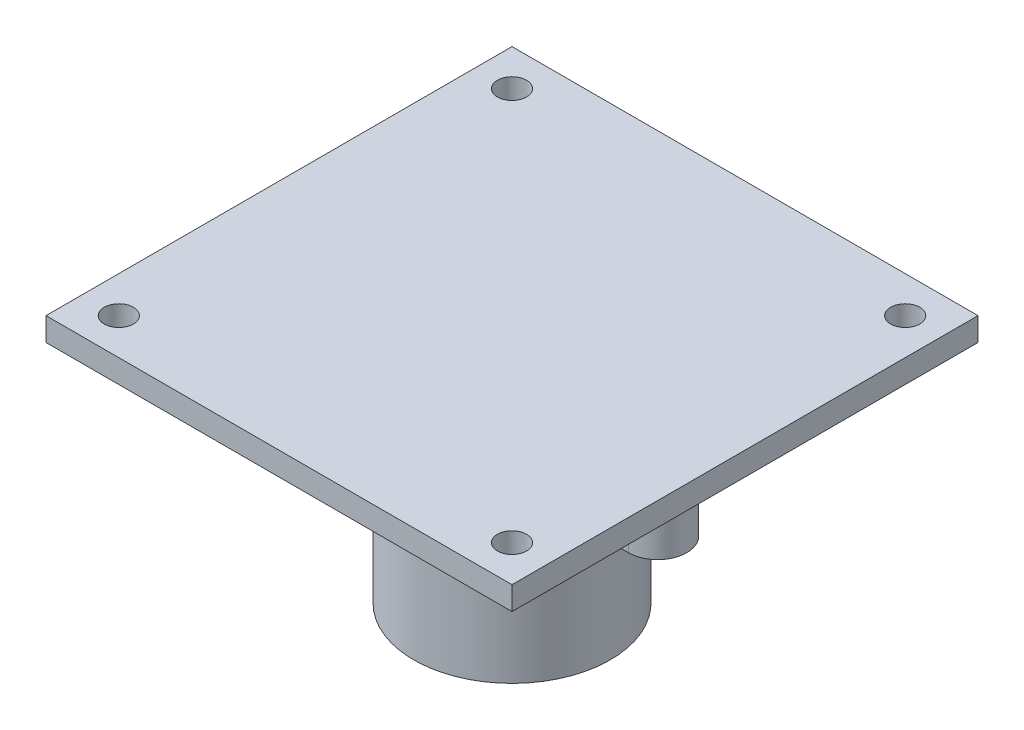
ISO-10303-21;
HEADER;
FILE_DESCRIPTION(('STEP AP214'),'2;1');
FILE_NAME('part.step','',(''),(''),'','','');
FILE_SCHEMA(('AUTOMOTIVE_DESIGN { 1 0 10303 214 1 1 1 1 }'));
ENDSEC;
DATA;
#1=APPLICATION_CONTEXT('core data for automotive mechanical design processes');
#2=APPLICATION_PROTOCOL_DEFINITION('international standard','automotive_design',2000,#1);
#3=PRODUCT_CONTEXT('',#1,'mechanical');
#4=PRODUCT('Part','Part','',(#3));
#5=PRODUCT_RELATED_PRODUCT_CATEGORY('part','',(#4));
#6=PRODUCT_DEFINITION_FORMATION('','',#4);
#7=PRODUCT_DEFINITION_CONTEXT('part definition',#1,'design');
#8=PRODUCT_DEFINITION('design','',#6,#7);
#9=PRODUCT_DEFINITION_SHAPE('','',#8);
#10=(LENGTH_UNIT() NAMED_UNIT(*) SI_UNIT(.MILLI.,.METRE.));
#11=(NAMED_UNIT(*) PLANE_ANGLE_UNIT() SI_UNIT($,.RADIAN.));
#12=(NAMED_UNIT(*) SI_UNIT($,.STERADIAN.) SOLID_ANGLE_UNIT());
#13=UNCERTAINTY_MEASURE_WITH_UNIT(LENGTH_MEASURE(1.E-05),#10,'distance_accuracy_value','');
#14=(GEOMETRIC_REPRESENTATION_CONTEXT(3) GLOBAL_UNCERTAINTY_ASSIGNED_CONTEXT((#13)) GLOBAL_UNIT_ASSIGNED_CONTEXT((#10,
#11,#12)) REPRESENTATION_CONTEXT('',''));
#15=CARTESIAN_POINT('',(0.,0.,0.));
#16=DIRECTION('',(0.,0.,1.));
#17=DIRECTION('',(1.,0.,0.));
#18=AXIS2_PLACEMENT_3D('',#15,#16,#17);
#19=CARTESIAN_POINT('',(0.,0.,0.));
#20=DIRECTION('',(0.,-1.,0.));
#21=DIRECTION('',(0.,0.,-1.));
#22=AXIS2_PLACEMENT_3D('',#19,#20,#21);
#23=PLANE('',#22);
#24=CARTESIAN_POINT('',(-13.5,0.,-13.5));
#25=DIRECTION('',(0.,1.,0.));
#26=DIRECTION('',(0.,0.,1.));
#27=AXIS2_PLACEMENT_3D('',#24,#25,#26);
#28=CIRCLE('',#27,0.999999999999999);
#29=CARTESIAN_POINT('',(-13.5,0.,-12.5));
#30=VERTEX_POINT('',#29);
#31=EDGE_CURVE('E190',#30,#30,#28,.T.);
#32=ORIENTED_EDGE('',*,*,#31,.T.);
#33=EDGE_LOOP('',(#32));
#34=FACE_BOUND('',#33,.T.);
#35=CARTESIAN_POINT('',(13.5,0.,-13.5));
#36=DIRECTION('',(0.,1.,0.));
#37=DIRECTION('',(0.,0.,1.));
#38=AXIS2_PLACEMENT_3D('',#35,#36,#37);
#39=CIRCLE('',#38,1.);
#40=CARTESIAN_POINT('',(13.5,0.,-12.5));
#41=VERTEX_POINT('',#40);
#42=EDGE_CURVE('E201',#41,#41,#39,.T.);
#43=ORIENTED_EDGE('',*,*,#42,.T.);
#44=EDGE_LOOP('',(#43));
#45=FACE_BOUND('',#44,.T.);
#46=DIRECTION('',(0.,0.,-1.));
#47=VECTOR('',#46,1.);
#48=CARTESIAN_POINT('',(16.,0.,16.));
#49=LINE('',#48,#47);
#50=CARTESIAN_POINT('',(16.,0.,16.));
#51=VERTEX_POINT('',#50);
#52=CARTESIAN_POINT('',(16.,0.,-16.));
#53=VERTEX_POINT('',#52);
#54=EDGE_CURVE('E207',#51,#53,#49,.T.);
#55=ORIENTED_EDGE('',*,*,#54,.F.);
#56=DIRECTION('',(1.,0.,0.));
#57=VECTOR('',#56,1.);
#58=CARTESIAN_POINT('',(-16.,0.,16.));
#59=LINE('',#58,#57);
#60=CARTESIAN_POINT('',(-16.,0.,16.));
#61=VERTEX_POINT('',#60);
#62=EDGE_CURVE('E214',#61,#51,#59,.T.);
#63=ORIENTED_EDGE('',*,*,#62,.F.);
#64=DIRECTION('',(0.,0.,1.));
#65=VECTOR('',#64,1.);
#66=CARTESIAN_POINT('',(-16.,0.,16.));
#67=LINE('',#66,#65);
#68=CARTESIAN_POINT('',(-16.,0.,-16.));
#69=VERTEX_POINT('',#68);
#70=EDGE_CURVE('E225',#69,#61,#67,.T.);
#71=ORIENTED_EDGE('',*,*,#70,.F.);
#72=DIRECTION('',(-1.,0.,0.));
#73=VECTOR('',#72,1.);
#74=CARTESIAN_POINT('',(-16.,0.,-16.));
#75=LINE('',#74,#73);
#76=EDGE_CURVE('E223',#53,#69,#75,.T.);
#77=ORIENTED_EDGE('',*,*,#76,.F.);
#78=EDGE_LOOP('',(#55,#63,#71,#77));
#79=FACE_BOUND('',#78,.T.);
#80=CARTESIAN_POINT('',(-13.5,0.,13.5));
#81=DIRECTION('',(0.,1.,0.));
#82=DIRECTION('',(0.,0.,-1.));
#83=AXIS2_PLACEMENT_3D('',#80,#81,#82);
#84=CIRCLE('',#83,0.999999999999999);
#85=CARTESIAN_POINT('',(-13.5,0.,12.5));
#86=VERTEX_POINT('',#85);
#87=EDGE_CURVE('E195',#86,#86,#84,.T.);
#88=ORIENTED_EDGE('',*,*,#87,.T.);
#89=EDGE_LOOP('',(#88));
#90=FACE_BOUND('',#89,.T.);
#91=CARTESIAN_POINT('',(13.5,0.,13.5));
#92=DIRECTION('',(0.,1.,0.));
#93=DIRECTION('',(0.,0.,-1.));
#94=AXIS2_PLACEMENT_3D('',#91,#92,#93);
#95=CIRCLE('',#94,0.999999999999999);
#96=CARTESIAN_POINT('',(13.5,0.,12.5));
#97=VERTEX_POINT('',#96);
#98=EDGE_CURVE('E180',#97,#97,#95,.T.);
#99=ORIENTED_EDGE('',*,*,#98,.T.);
#100=EDGE_LOOP('',(#99));
#101=FACE_BOUND('',#100,.T.);
#102=DIRECTION('',(0.,0.,1.));
#103=VECTOR('',#102,1.);
#104=CARTESIAN_POINT('',(8.,0.,0.));
#105=LINE('',#104,#103);
#106=CARTESIAN_POINT('',(8.,0.,-8.));
#107=VERTEX_POINT('',#106);
#108=CARTESIAN_POINT('',(8.,0.,-2.));
#109=VERTEX_POINT('',#108);
#110=EDGE_CURVE('E59',#107,#109,#105,.T.);
#111=ORIENTED_EDGE('',*,*,#110,.F.);
#112=DIRECTION('',(1.,0.,0.));
#113=VECTOR('',#112,1.);
#114=CARTESIAN_POINT('',(0.,0.,-8.));
#115=LINE('',#114,#113);
#116=CARTESIAN_POINT('',(-8.,0.,-8.));
#117=VERTEX_POINT('',#116);
#118=EDGE_CURVE('E179',#117,#107,#115,.T.);
#119=ORIENTED_EDGE('',*,*,#118,.F.);
#120=DIRECTION('',(0.,0.,1.));
#121=VECTOR('',#120,1.);
#122=CARTESIAN_POINT('',(-8.,0.,0.));
#123=LINE('',#122,#121);
#124=CARTESIAN_POINT('',(-8.,0.,-2.));
#125=VERTEX_POINT('',#124);
#126=EDGE_CURVE('E176',#117,#125,#123,.T.);
#127=ORIENTED_EDGE('',*,*,#126,.T.);
#128=DIRECTION('',(-1.,0.,0.));
#129=VECTOR('',#128,1.);
#130=CARTESIAN_POINT('',(0.,0.,-2.));
#131=LINE('',#130,#129);
#132=CARTESIAN_POINT('',(-10.,0.,-2.));
#133=VERTEX_POINT('',#132);
#134=EDGE_CURVE('E541',#125,#133,#131,.T.);
#135=ORIENTED_EDGE('',*,*,#134,.T.);
#136=CARTESIAN_POINT('',(-10.,0.,0.));
#137=DIRECTION('',(0.,-1.,0.));
#138=DIRECTION('',(0.,0.,-1.));
#139=AXIS2_PLACEMENT_3D('',#136,#137,#138);
#140=CIRCLE('',#139,2.);
#141=CARTESIAN_POINT('',(-10.,0.,2.));
#142=VERTEX_POINT('',#141);
#143=EDGE_CURVE('E538',#142,#133,#140,.T.);
#144=ORIENTED_EDGE('',*,*,#143,.F.);
#145=DIRECTION('',(-1.,0.,0.));
#146=VECTOR('',#145,1.);
#147=CARTESIAN_POINT('',(0.,0.,2.));
#148=LINE('',#147,#146);
#149=CARTESIAN_POINT('',(-8.,0.,2.));
#150=VERTEX_POINT('',#149);
#151=EDGE_CURVE('E535',#150,#142,#148,.T.);
#152=ORIENTED_EDGE('',*,*,#151,.F.);
#153=CARTESIAN_POINT('',(-8.,0.,8.));
#154=VERTEX_POINT('',#153);
#155=EDGE_CURVE('E533',#150,#154,#123,.T.);
#156=ORIENTED_EDGE('',*,*,#155,.T.);
#157=DIRECTION('',(1.,0.,0.));
#158=VECTOR('',#157,1.);
#159=CARTESIAN_POINT('',(0.,0.,8.));
#160=LINE('',#159,#158);
#161=CARTESIAN_POINT('',(8.,0.,8.));
#162=VERTEX_POINT('',#161);
#163=EDGE_CURVE('E531',#154,#162,#160,.T.);
#164=ORIENTED_EDGE('',*,*,#163,.T.);
#165=CARTESIAN_POINT('',(8.,0.,2.));
#166=VERTEX_POINT('',#165);
#167=EDGE_CURVE('E525',#166,#162,#105,.T.);
#168=ORIENTED_EDGE('',*,*,#167,.F.);
#169=DIRECTION('',(1.,0.,0.));
#170=VECTOR('',#169,1.);
#171=CARTESIAN_POINT('',(0.,0.,2.));
#172=LINE('',#171,#170);
#173=CARTESIAN_POINT('',(10.,0.,2.));
#174=VERTEX_POINT('',#173);
#175=EDGE_CURVE('E529',#166,#174,#172,.T.);
#176=ORIENTED_EDGE('',*,*,#175,.T.);
#177=CARTESIAN_POINT('',(10.,0.,0.));
#178=DIRECTION('',(0.,-1.,0.));
#179=DIRECTION('',(0.,0.,-1.));
#180=AXIS2_PLACEMENT_3D('',#177,#178,#179);
#181=CIRCLE('',#180,2.);
#182=CARTESIAN_POINT('',(10.,0.,-2.));
#183=VERTEX_POINT('',#182);
#184=EDGE_CURVE('E527',#174,#183,#181,.F.);
#185=ORIENTED_EDGE('',*,*,#184,.T.);
#186=DIRECTION('',(1.,0.,0.));
#187=VECTOR('',#186,1.);
#188=CARTESIAN_POINT('',(0.,0.,-2.));
#189=LINE('',#188,#187);
#190=EDGE_CURVE('E64',#109,#183,#189,.T.);
#191=ORIENTED_EDGE('',*,*,#190,.F.);
#192=EDGE_LOOP('',(#111,#119,#127,#135,#144,#152,#156,#164,#168,#176,#185,#191));
#193=FACE_BOUND('',#192,.T.);
#194=ADVANCED_FACE('F43',(#34,#45,#79,#90,#101,#193),#23,.T.);
#195=CARTESIAN_POINT('',(0.,1.6,0.));
#196=DIRECTION('',(0.,-1.,0.));
#197=DIRECTION('',(0.,0.,-1.));
#198=AXIS2_PLACEMENT_3D('',#195,#196,#197);
#199=PLANE('',#198);
#200=DIRECTION('',(0.,0.,-1.));
#201=VECTOR('',#200,1.);
#202=CARTESIAN_POINT('',(16.,1.6,16.));
#203=LINE('',#202,#201);
#204=CARTESIAN_POINT('',(16.,1.6,16.));
#205=VERTEX_POINT('',#204);
#206=CARTESIAN_POINT('',(16.,1.6,-16.));
#207=VERTEX_POINT('',#206);
#208=EDGE_CURVE('E210',#205,#207,#203,.T.);
#209=ORIENTED_EDGE('',*,*,#208,.T.);
#210=DIRECTION('',(-1.,0.,0.));
#211=VECTOR('',#210,1.);
#212=CARTESIAN_POINT('',(-16.,1.6,-16.));
#213=LINE('',#212,#211);
#214=CARTESIAN_POINT('',(-16.,1.6,-16.));
#215=VERTEX_POINT('',#214);
#216=EDGE_CURVE('E213',#207,#215,#213,.T.);
#217=ORIENTED_EDGE('',*,*,#216,.T.);
#218=DIRECTION('',(0.,0.,1.));
#219=VECTOR('',#218,1.);
#220=CARTESIAN_POINT('',(-16.,1.6,16.));
#221=LINE('',#220,#219);
#222=CARTESIAN_POINT('',(-16.,1.6,16.));
#223=VERTEX_POINT('',#222);
#224=EDGE_CURVE('E216',#215,#223,#221,.T.);
#225=ORIENTED_EDGE('',*,*,#224,.T.);
#226=DIRECTION('',(1.,0.,0.));
#227=VECTOR('',#226,1.);
#228=CARTESIAN_POINT('',(-16.,1.6,16.));
#229=LINE('',#228,#227);
#230=EDGE_CURVE('E218',#223,#205,#229,.T.);
#231=ORIENTED_EDGE('',*,*,#230,.T.);
#232=EDGE_LOOP('',(#209,#217,#225,#231));
#233=FACE_BOUND('',#232,.T.);
#234=CARTESIAN_POINT('',(13.5,1.6,-13.5));
#235=DIRECTION('',(0.,1.,0.));
#236=DIRECTION('',(0.,0.,1.));
#237=AXIS2_PLACEMENT_3D('',#234,#235,#236);
#238=CIRCLE('',#237,1.);
#239=CARTESIAN_POINT('',(13.5,1.6,-12.5));
#240=VERTEX_POINT('',#239);
#241=EDGE_CURVE('E204',#240,#240,#238,.T.);
#242=ORIENTED_EDGE('',*,*,#241,.F.);
#243=EDGE_LOOP('',(#242));
#244=FACE_BOUND('',#243,.T.);
#245=CARTESIAN_POINT('',(-13.5,1.6,13.5));
#246=DIRECTION('',(0.,1.,0.));
#247=DIRECTION('',(0.,0.,-1.));
#248=AXIS2_PLACEMENT_3D('',#245,#246,#247);
#249=CIRCLE('',#248,0.999999999999999);
#250=CARTESIAN_POINT('',(-13.5,1.6,12.5));
#251=VERTEX_POINT('',#250);
#252=EDGE_CURVE('E198',#251,#251,#249,.T.);
#253=ORIENTED_EDGE('',*,*,#252,.F.);
#254=EDGE_LOOP('',(#253));
#255=FACE_BOUND('',#254,.T.);
#256=CARTESIAN_POINT('',(-13.5,1.6,-13.5));
#257=DIRECTION('',(0.,1.,0.));
#258=DIRECTION('',(0.,0.,1.));
#259=AXIS2_PLACEMENT_3D('',#256,#257,#258);
#260=CIRCLE('',#259,0.999999999999999);
#261=CARTESIAN_POINT('',(-13.5,1.6,-12.5));
#262=VERTEX_POINT('',#261);
#263=EDGE_CURVE('E192',#262,#262,#260,.T.);
#264=ORIENTED_EDGE('',*,*,#263,.F.);
#265=EDGE_LOOP('',(#264));
#266=FACE_BOUND('',#265,.T.);
#267=CARTESIAN_POINT('',(13.5,1.6,13.5));
#268=DIRECTION('',(0.,1.,0.));
#269=DIRECTION('',(0.,0.,-1.));
#270=AXIS2_PLACEMENT_3D('',#267,#268,#269);
#271=CIRCLE('',#270,0.999999999999999);
#272=CARTESIAN_POINT('',(13.5,1.6,12.5));
#273=VERTEX_POINT('',#272);
#274=EDGE_CURVE('E183',#273,#273,#271,.T.);
#275=ORIENTED_EDGE('',*,*,#274,.F.);
#276=EDGE_LOOP('',(#275));
#277=FACE_BOUND('',#276,.T.);
#278=ADVANCED_FACE('F255',(#233,#244,#255,#266,#277),#199,.F.);
#279=CARTESIAN_POINT('',(16.,1.6,16.));
#280=DIRECTION('',(-1.,0.,0.));
#281=DIRECTION('',(0.,0.,1.));
#282=AXIS2_PLACEMENT_3D('',#279,#280,#281);
#283=PLANE('',#282);
#284=ORIENTED_EDGE('',*,*,#54,.T.);
#285=DIRECTION('',(0.,-1.,0.));
#286=VECTOR('',#285,1.);
#287=CARTESIAN_POINT('',(16.,1.6,-16.));
#288=LINE('',#287,#286);
#289=EDGE_CURVE('E47',#207,#53,#288,.T.);
#290=ORIENTED_EDGE('',*,*,#289,.F.);
#291=ORIENTED_EDGE('',*,*,#208,.F.);
#292=DIRECTION('',(0.,-1.,0.));
#293=VECTOR('',#292,1.);
#294=CARTESIAN_POINT('',(16.,1.6,16.));
#295=LINE('',#294,#293);
#296=EDGE_CURVE('E220',#205,#51,#295,.T.);
#297=ORIENTED_EDGE('',*,*,#296,.T.);
#298=EDGE_LOOP('',(#284,#290,#291,#297));
#299=FACE_BOUND('',#298,.T.);
#300=ADVANCED_FACE('F45',(#299),#283,.F.);
#301=CARTESIAN_POINT('',(-16.,1.6,-16.));
#302=DIRECTION('',(0.,0.,1.));
#303=DIRECTION('',(1.,0.,0.));
#304=AXIS2_PLACEMENT_3D('',#301,#302,#303);
#305=PLANE('',#304);
#306=ORIENTED_EDGE('',*,*,#76,.T.);
#307=DIRECTION('',(0.,-1.,0.));
#308=VECTOR('',#307,1.);
#309=CARTESIAN_POINT('',(-16.,1.6,-16.));
#310=LINE('',#309,#308);
#311=EDGE_CURVE('E232',#215,#69,#310,.T.);
#312=ORIENTED_EDGE('',*,*,#311,.F.);
#313=ORIENTED_EDGE('',*,*,#216,.F.);
#314=ORIENTED_EDGE('',*,*,#289,.T.);
#315=EDGE_LOOP('',(#306,#312,#313,#314));
#316=FACE_BOUND('',#315,.T.);
#317=ADVANCED_FACE('F241',(#316),#305,.F.);
#318=CARTESIAN_POINT('',(-16.,1.6,16.));
#319=DIRECTION('',(1.,0.,0.));
#320=DIRECTION('',(0.,0.,-1.));
#321=AXIS2_PLACEMENT_3D('',#318,#319,#320);
#322=PLANE('',#321);
#323=ORIENTED_EDGE('',*,*,#70,.T.);
#324=DIRECTION('',(0.,-1.,0.));
#325=VECTOR('',#324,1.);
#326=CARTESIAN_POINT('',(-16.,1.6,16.));
#327=LINE('',#326,#325);
#328=EDGE_CURVE('E230',#223,#61,#327,.T.);
#329=ORIENTED_EDGE('',*,*,#328,.F.);
#330=ORIENTED_EDGE('',*,*,#224,.F.);
#331=ORIENTED_EDGE('',*,*,#311,.T.);
#332=EDGE_LOOP('',(#323,#329,#330,#331));
#333=FACE_BOUND('',#332,.T.);
#334=ADVANCED_FACE('F250',(#333),#322,.F.);
#335=CARTESIAN_POINT('',(-16.,1.6,16.));
#336=DIRECTION('',(0.,0.,-1.));
#337=DIRECTION('',(-1.,0.,0.));
#338=AXIS2_PLACEMENT_3D('',#335,#336,#337);
#339=PLANE('',#338);
#340=ORIENTED_EDGE('',*,*,#62,.T.);
#341=ORIENTED_EDGE('',*,*,#296,.F.);
#342=ORIENTED_EDGE('',*,*,#230,.F.);
#343=ORIENTED_EDGE('',*,*,#328,.T.);
#344=EDGE_LOOP('',(#340,#341,#342,#343));
#345=FACE_BOUND('',#344,.T.);
#346=ADVANCED_FACE('F253',(#345),#339,.F.);
#347=CARTESIAN_POINT('',(13.5,1.6,-13.5));
#348=DIRECTION('',(0.,-1.,0.));
#349=DIRECTION('',(0.,0.,-1.));
#350=AXIS2_PLACEMENT_3D('',#347,#348,#349);
#351=CYLINDRICAL_SURFACE('',#350,1.);
#352=ORIENTED_EDGE('',*,*,#241,.T.);
#353=EDGE_LOOP('',(#352));
#354=FACE_BOUND('',#353,.T.);
#355=ORIENTED_EDGE('',*,*,#42,.F.);
#356=EDGE_LOOP('',(#355));
#357=FACE_BOUND('',#356,.T.);
#358=ADVANCED_FACE('F285',(#354,#357),#351,.F.);
#359=CARTESIAN_POINT('',(-13.5,1.6,13.5));
#360=DIRECTION('',(0.,-1.,0.));
#361=DIRECTION('',(0.,0.,-1.));
#362=AXIS2_PLACEMENT_3D('',#359,#360,#361);
#363=CYLINDRICAL_SURFACE('',#362,0.999999999999999);
#364=ORIENTED_EDGE('',*,*,#252,.T.);
#365=EDGE_LOOP('',(#364));
#366=FACE_BOUND('',#365,.T.);
#367=ORIENTED_EDGE('',*,*,#87,.F.);
#368=EDGE_LOOP('',(#367));
#369=FACE_BOUND('',#368,.T.);
#370=ADVANCED_FACE('F322',(#366,#369),#363,.F.);
#371=CARTESIAN_POINT('',(-13.5,1.6,-13.5));
#372=DIRECTION('',(0.,-1.,0.));
#373=DIRECTION('',(0.,0.,-1.));
#374=AXIS2_PLACEMENT_3D('',#371,#372,#373);
#375=CYLINDRICAL_SURFACE('',#374,0.999999999999999);
#376=ORIENTED_EDGE('',*,*,#263,.T.);
#377=EDGE_LOOP('',(#376));
#378=FACE_BOUND('',#377,.T.);
#379=ORIENTED_EDGE('',*,*,#31,.F.);
#380=EDGE_LOOP('',(#379));
#381=FACE_BOUND('',#380,.T.);
#382=ADVANCED_FACE('F270',(#378,#381),#375,.F.);
#383=CARTESIAN_POINT('',(13.5,1.6,13.5));
#384=DIRECTION('',(0.,-1.,0.));
#385=DIRECTION('',(0.,0.,-1.));
#386=AXIS2_PLACEMENT_3D('',#383,#384,#385);
#387=CYLINDRICAL_SURFACE('',#386,0.999999999999999);
#388=ORIENTED_EDGE('',*,*,#274,.T.);
#389=EDGE_LOOP('',(#388));
#390=FACE_BOUND('',#389,.T.);
#391=ORIENTED_EDGE('',*,*,#98,.F.);
#392=EDGE_LOOP('',(#391));
#393=FACE_BOUND('',#392,.T.);
#394=ADVANCED_FACE('F267',(#390,#393),#387,.F.);
#395=CARTESIAN_POINT('',(0.,-6.5,-8.));
#396=DIRECTION('',(0.,0.,1.));
#397=DIRECTION('',(1.,0.,0.));
#398=AXIS2_PLACEMENT_3D('',#395,#396,#397);
#399=PLANE('',#398);
#400=ORIENTED_EDGE('',*,*,#118,.T.);
#401=DIRECTION('',(0.,1.,0.));
#402=VECTOR('',#401,1.);
#403=CARTESIAN_POINT('',(8.,-6.5,-8.));
#404=LINE('',#403,#402);
#405=CARTESIAN_POINT('',(8.,-6.5,-8.));
#406=VERTEX_POINT('',#405);
#407=EDGE_CURVE('E158',#406,#107,#404,.T.);
#408=ORIENTED_EDGE('',*,*,#407,.F.);
#409=DIRECTION('',(1.,0.,0.));
#410=VECTOR('',#409,1.);
#411=CARTESIAN_POINT('',(0.,-6.5,-8.));
#412=LINE('',#411,#410);
#413=CARTESIAN_POINT('',(-8.,-6.5,-8.));
#414=VERTEX_POINT('',#413);
#415=EDGE_CURVE('E165',#414,#406,#412,.T.);
#416=ORIENTED_EDGE('',*,*,#415,.F.);
#417=DIRECTION('',(0.,1.,0.));
#418=VECTOR('',#417,1.);
#419=CARTESIAN_POINT('',(-8.,-6.5,-8.));
#420=LINE('',#419,#418);
#421=EDGE_CURVE('E543',#414,#117,#420,.T.);
#422=ORIENTED_EDGE('',*,*,#421,.T.);
#423=EDGE_LOOP('',(#400,#408,#416,#422));
#424=FACE_BOUND('',#423,.T.);
#425=ADVANCED_FACE('F178',(#424),#399,.F.);
#426=CARTESIAN_POINT('',(8.,-6.5,0.));
#427=DIRECTION('',(-1.,0.,0.));
#428=DIRECTION('',(0.,0.,1.));
#429=AXIS2_PLACEMENT_3D('',#426,#427,#428);
#430=PLANE('',#429);
#431=ORIENTED_EDGE('',*,*,#110,.T.);
#432=DIRECTION('',(0.,1.,0.));
#433=VECTOR('',#432,1.);
#434=CARTESIAN_POINT('',(8.,-6.5,-2.));
#435=LINE('',#434,#433);
#436=CARTESIAN_POINT('',(8.,-6.5,-2.));
#437=VERTEX_POINT('',#436);
#438=EDGE_CURVE('E161',#437,#109,#435,.T.);
#439=ORIENTED_EDGE('',*,*,#438,.F.);
#440=DIRECTION('',(0.,0.,1.));
#441=VECTOR('',#440,1.);
#442=CARTESIAN_POINT('',(8.,-6.5,0.));
#443=LINE('',#442,#441);
#444=EDGE_CURVE('E154',#406,#437,#443,.T.);
#445=ORIENTED_EDGE('',*,*,#444,.F.);
#446=ORIENTED_EDGE('',*,*,#407,.T.);
#447=EDGE_LOOP('',(#431,#439,#445,#446));
#448=FACE_BOUND('',#447,.T.);
#449=ADVANCED_FACE('F156',(#448),#430,.F.);
#450=CARTESIAN_POINT('',(0.,-6.5,-2.));
#451=DIRECTION('',(0.,0.,1.));
#452=DIRECTION('',(1.,0.,0.));
#453=AXIS2_PLACEMENT_3D('',#450,#451,#452);
#454=PLANE('',#453);
#455=ORIENTED_EDGE('',*,*,#190,.T.);
#456=DIRECTION('',(0.,1.,0.));
#457=VECTOR('',#456,1.);
#458=CARTESIAN_POINT('',(10.,-6.5,-2.));
#459=LINE('',#458,#457);
#460=CARTESIAN_POINT('',(10.,-6.5,-2.));
#461=VERTEX_POINT('',#460);
#462=EDGE_CURVE('E185',#461,#183,#459,.T.);
#463=ORIENTED_EDGE('',*,*,#462,.F.);
#464=DIRECTION('',(1.,0.,0.));
#465=VECTOR('',#464,1.);
#466=CARTESIAN_POINT('',(0.,-6.5,-2.));
#467=LINE('',#466,#465);
#468=EDGE_CURVE('E164',#437,#461,#467,.T.);
#469=ORIENTED_EDGE('',*,*,#468,.F.);
#470=ORIENTED_EDGE('',*,*,#438,.T.);
#471=EDGE_LOOP('',(#455,#463,#469,#470));
#472=FACE_BOUND('',#471,.T.);
#473=ADVANCED_FACE('F361',(#472),#454,.F.);
#474=CARTESIAN_POINT('',(10.,-6.5,0.));
#475=DIRECTION('',(0.,1.,0.));
#476=DIRECTION('',(0.,0.,1.));
#477=AXIS2_PLACEMENT_3D('',#474,#475,#476);
#478=CYLINDRICAL_SURFACE('',#477,2.);
#479=ORIENTED_EDGE('',*,*,#184,.F.);
#480=DIRECTION('',(0.,1.,0.));
#481=VECTOR('',#480,1.);
#482=CARTESIAN_POINT('',(10.,-6.5,2.));
#483=LINE('',#482,#481);
#484=CARTESIAN_POINT('',(10.,-6.5,2.));
#485=VERTEX_POINT('',#484);
#486=EDGE_CURVE('E566',#485,#174,#483,.T.);
#487=ORIENTED_EDGE('',*,*,#486,.F.);
#488=CARTESIAN_POINT('',(10.,-6.5,0.));
#489=DIRECTION('',(0.,-1.,0.));
#490=DIRECTION('',(0.,0.,-1.));
#491=AXIS2_PLACEMENT_3D('',#488,#489,#490);
#492=CIRCLE('',#491,2.);
#493=EDGE_CURVE('E505',#485,#461,#492,.F.);
#494=ORIENTED_EDGE('',*,*,#493,.T.);
#495=ORIENTED_EDGE('',*,*,#462,.T.);
#496=EDGE_LOOP('',(#479,#487,#494,#495));
#497=FACE_BOUND('',#496,.T.);
#498=ADVANCED_FACE('F370',(#497),#478,.T.);
#499=CARTESIAN_POINT('',(0.,-6.5,2.));
#500=DIRECTION('',(0.,0.,1.));
#501=DIRECTION('',(1.,0.,0.));
#502=AXIS2_PLACEMENT_3D('',#499,#500,#501);
#503=PLANE('',#502);
#504=ORIENTED_EDGE('',*,*,#175,.F.);
#505=DIRECTION('',(0.,1.,0.));
#506=VECTOR('',#505,1.);
#507=CARTESIAN_POINT('',(8.,-6.5,2.));
#508=LINE('',#507,#506);
#509=CARTESIAN_POINT('',(8.,-6.5,2.));
#510=VERTEX_POINT('',#509);
#511=EDGE_CURVE('E563',#510,#166,#508,.T.);
#512=ORIENTED_EDGE('',*,*,#511,.F.);
#513=DIRECTION('',(1.,0.,0.));
#514=VECTOR('',#513,1.);
#515=CARTESIAN_POINT('',(0.,-6.5,2.));
#516=LINE('',#515,#514);
#517=EDGE_CURVE('E508',#510,#485,#516,.T.);
#518=ORIENTED_EDGE('',*,*,#517,.T.);
#519=ORIENTED_EDGE('',*,*,#486,.T.);
#520=EDGE_LOOP('',(#504,#512,#518,#519));
#521=FACE_BOUND('',#520,.T.);
#522=ADVANCED_FACE('F379',(#521),#503,.T.);
#523=ORIENTED_EDGE('',*,*,#167,.T.);
#524=DIRECTION('',(0.,1.,0.));
#525=VECTOR('',#524,1.);
#526=CARTESIAN_POINT('',(8.,-6.5,8.));
#527=LINE('',#526,#525);
#528=CARTESIAN_POINT('',(8.,-6.5,8.));
#529=VERTEX_POINT('',#528);
#530=EDGE_CURVE('E560',#529,#162,#527,.T.);
#531=ORIENTED_EDGE('',*,*,#530,.F.);
#532=EDGE_CURVE('E167',#510,#529,#443,.T.);
#533=ORIENTED_EDGE('',*,*,#532,.F.);
#534=ORIENTED_EDGE('',*,*,#511,.T.);
#535=EDGE_LOOP('',(#523,#531,#533,#534));
#536=FACE_BOUND('',#535,.T.);
#537=ADVANCED_FACE('F363',(#536),#430,.F.);
#538=CARTESIAN_POINT('',(0.,-6.5,8.));
#539=DIRECTION('',(0.,0.,1.));
#540=DIRECTION('',(1.,0.,0.));
#541=AXIS2_PLACEMENT_3D('',#538,#539,#540);
#542=PLANE('',#541);
#543=ORIENTED_EDGE('',*,*,#163,.F.);
#544=DIRECTION('',(0.,1.,0.));
#545=VECTOR('',#544,1.);
#546=CARTESIAN_POINT('',(-8.,-6.5,8.));
#547=LINE('',#546,#545);
#548=CARTESIAN_POINT('',(-8.,-6.5,8.));
#549=VERTEX_POINT('',#548);
#550=EDGE_CURVE('E557',#549,#154,#547,.T.);
#551=ORIENTED_EDGE('',*,*,#550,.F.);
#552=DIRECTION('',(1.,0.,0.));
#553=VECTOR('',#552,1.);
#554=CARTESIAN_POINT('',(0.,-6.5,8.));
#555=LINE('',#554,#553);
#556=EDGE_CURVE('E511',#549,#529,#555,.T.);
#557=ORIENTED_EDGE('',*,*,#556,.T.);
#558=ORIENTED_EDGE('',*,*,#530,.T.);
#559=EDGE_LOOP('',(#543,#551,#557,#558));
#560=FACE_BOUND('',#559,.T.);
#561=ADVANCED_FACE('F396',(#560),#542,.T.);
#562=CARTESIAN_POINT('',(-8.,-6.5,0.));
#563=DIRECTION('',(-1.,0.,0.));
#564=DIRECTION('',(0.,0.,1.));
#565=AXIS2_PLACEMENT_3D('',#562,#563,#564);
#566=PLANE('',#565);
#567=ORIENTED_EDGE('',*,*,#155,.F.);
#568=DIRECTION('',(0.,1.,0.));
#569=VECTOR('',#568,1.);
#570=CARTESIAN_POINT('',(-8.,-6.5,2.));
#571=LINE('',#570,#569);
#572=CARTESIAN_POINT('',(-8.,-6.5,2.));
#573=VERTEX_POINT('',#572);
#574=EDGE_CURVE('E554',#573,#150,#571,.T.);
#575=ORIENTED_EDGE('',*,*,#574,.F.);
#576=DIRECTION('',(0.,0.,1.));
#577=VECTOR('',#576,1.);
#578=CARTESIAN_POINT('',(-8.,-6.5,0.));
#579=LINE('',#578,#577);
#580=EDGE_CURVE('E514',#573,#549,#579,.T.);
#581=ORIENTED_EDGE('',*,*,#580,.T.);
#582=ORIENTED_EDGE('',*,*,#550,.T.);
#583=EDGE_LOOP('',(#567,#575,#581,#582));
#584=FACE_BOUND('',#583,.T.);
#585=ADVANCED_FACE('F404',(#584),#566,.T.);
#586=CARTESIAN_POINT('',(0.,-6.5,2.));
#587=DIRECTION('',(0.,0.,-1.));
#588=DIRECTION('',(-1.,0.,0.));
#589=AXIS2_PLACEMENT_3D('',#586,#587,#588);
#590=PLANE('',#589);
#591=ORIENTED_EDGE('',*,*,#151,.T.);
#592=DIRECTION('',(0.,1.,0.));
#593=VECTOR('',#592,1.);
#594=CARTESIAN_POINT('',(-10.,-6.5,2.));
#595=LINE('',#594,#593);
#596=CARTESIAN_POINT('',(-10.,-6.5,2.));
#597=VERTEX_POINT('',#596);
#598=EDGE_CURVE('E551',#597,#142,#595,.T.);
#599=ORIENTED_EDGE('',*,*,#598,.F.);
#600=DIRECTION('',(-1.,0.,0.));
#601=VECTOR('',#600,1.);
#602=CARTESIAN_POINT('',(0.,-6.5,2.));
#603=LINE('',#602,#601);
#604=EDGE_CURVE('E517',#573,#597,#603,.T.);
#605=ORIENTED_EDGE('',*,*,#604,.F.);
#606=ORIENTED_EDGE('',*,*,#574,.T.);
#607=EDGE_LOOP('',(#591,#599,#605,#606));
#608=FACE_BOUND('',#607,.T.);
#609=ADVANCED_FACE('F413',(#608),#590,.F.);
#610=CARTESIAN_POINT('',(-10.,-6.5,0.));
#611=DIRECTION('',(0.,1.,0.));
#612=DIRECTION('',(0.,0.,1.));
#613=AXIS2_PLACEMENT_3D('',#610,#611,#612);
#614=CYLINDRICAL_SURFACE('',#613,2.);
#615=ORIENTED_EDGE('',*,*,#143,.T.);
#616=DIRECTION('',(0.,1.,0.));
#617=VECTOR('',#616,1.);
#618=CARTESIAN_POINT('',(-10.,-6.5,-2.));
#619=LINE('',#618,#617);
#620=CARTESIAN_POINT('',(-10.,-6.5,-2.));
#621=VERTEX_POINT('',#620);
#622=EDGE_CURVE('E548',#621,#133,#619,.T.);
#623=ORIENTED_EDGE('',*,*,#622,.F.);
#624=CARTESIAN_POINT('',(-10.,-6.5,0.));
#625=DIRECTION('',(0.,-1.,0.));
#626=DIRECTION('',(0.,0.,-1.));
#627=AXIS2_PLACEMENT_3D('',#624,#625,#626);
#628=CIRCLE('',#627,2.);
#629=EDGE_CURVE('E519',#597,#621,#628,.T.);
#630=ORIENTED_EDGE('',*,*,#629,.F.);
#631=ORIENTED_EDGE('',*,*,#598,.T.);
#632=EDGE_LOOP('',(#615,#623,#630,#631));
#633=FACE_BOUND('',#632,.T.);
#634=ADVANCED_FACE('F423',(#633),#614,.T.);
#635=CARTESIAN_POINT('',(0.,-6.5,-2.));
#636=DIRECTION('',(0.,0.,-1.));
#637=DIRECTION('',(-1.,0.,0.));
#638=AXIS2_PLACEMENT_3D('',#635,#636,#637);
#639=PLANE('',#638);
#640=ORIENTED_EDGE('',*,*,#134,.F.);
#641=DIRECTION('',(0.,1.,0.));
#642=VECTOR('',#641,1.);
#643=CARTESIAN_POINT('',(-8.,-6.5,-2.));
#644=LINE('',#643,#642);
#645=CARTESIAN_POINT('',(-8.,-6.5,-2.));
#646=VERTEX_POINT('',#645);
#647=EDGE_CURVE('E545',#646,#125,#644,.T.);
#648=ORIENTED_EDGE('',*,*,#647,.F.);
#649=DIRECTION('',(-1.,0.,0.));
#650=VECTOR('',#649,1.);
#651=CARTESIAN_POINT('',(0.,-6.5,-2.));
#652=LINE('',#651,#650);
#653=EDGE_CURVE('E521',#646,#621,#652,.T.);
#654=ORIENTED_EDGE('',*,*,#653,.T.);
#655=ORIENTED_EDGE('',*,*,#622,.T.);
#656=EDGE_LOOP('',(#640,#648,#654,#655));
#657=FACE_BOUND('',#656,.T.);
#658=ADVANCED_FACE('F432',(#657),#639,.T.);
#659=ORIENTED_EDGE('',*,*,#126,.F.);
#660=ORIENTED_EDGE('',*,*,#421,.F.);
#661=EDGE_CURVE('E173',#414,#646,#579,.T.);
#662=ORIENTED_EDGE('',*,*,#661,.T.);
#663=ORIENTED_EDGE('',*,*,#647,.T.);
#664=EDGE_LOOP('',(#659,#660,#662,#663));
#665=FACE_BOUND('',#664,.T.);
#666=ADVANCED_FACE('F416',(#665),#566,.T.);
#667=CARTESIAN_POINT('',(0.,-6.5,0.));
#668=DIRECTION('',(0.,-1.,0.));
#669=DIRECTION('',(0.,0.,-1.));
#670=AXIS2_PLACEMENT_3D('',#667,#668,#669);
#671=PLANE('',#670);
#672=CARTESIAN_POINT('',(0.,-6.5,0.));
#673=DIRECTION('',(0.,-1.,0.));
#674=DIRECTION('',(0.,0.,-1.));
#675=AXIS2_PLACEMENT_3D('',#672,#673,#674);
#676=CIRCLE('',#675,6.75);
#677=CARTESIAN_POINT('',(0.,-6.5,-6.75));
#678=VERTEX_POINT('',#677);
#679=EDGE_CURVE('E11',#678,#678,#676,.T.);
#680=ORIENTED_EDGE('',*,*,#679,.F.);
#681=EDGE_LOOP('',(#680));
#682=FACE_BOUND('',#681,.T.);
#683=ORIENTED_EDGE('',*,*,#415,.T.);
#684=ORIENTED_EDGE('',*,*,#444,.T.);
#685=ORIENTED_EDGE('',*,*,#468,.T.);
#686=ORIENTED_EDGE('',*,*,#493,.F.);
#687=ORIENTED_EDGE('',*,*,#517,.F.);
#688=ORIENTED_EDGE('',*,*,#532,.T.);
#689=ORIENTED_EDGE('',*,*,#556,.F.);
#690=ORIENTED_EDGE('',*,*,#580,.F.);
#691=ORIENTED_EDGE('',*,*,#604,.T.);
#692=ORIENTED_EDGE('',*,*,#629,.T.);
#693=ORIENTED_EDGE('',*,*,#653,.F.);
#694=ORIENTED_EDGE('',*,*,#661,.F.);
#695=EDGE_LOOP('',(#683,#684,#685,#686,#687,#688,#689,#690,#691,#692,#693,#694));
#696=FACE_BOUND('',#695,.T.);
#697=ADVANCED_FACE('F170',(#682,#696),#671,.T.);
#698=CARTESIAN_POINT('',(0.,-15.5,0.));
#699=DIRECTION('',(0.,1.,0.));
#700=DIRECTION('',(0.,0.,1.));
#701=AXIS2_PLACEMENT_3D('',#698,#699,#700);
#702=CYLINDRICAL_SURFACE('',#701,6.75);
#703=CARTESIAN_POINT('',(0.,-15.5,0.));
#704=DIRECTION('',(0.,-1.,0.));
#705=DIRECTION('',(0.,0.,-1.));
#706=AXIS2_PLACEMENT_3D('',#703,#704,#705);
#707=CIRCLE('',#706,6.75);
#708=CARTESIAN_POINT('',(0.,-15.5,-6.75));
#709=VERTEX_POINT('',#708);
#710=EDGE_CURVE('E500',#709,#709,#707,.T.);
#711=ORIENTED_EDGE('',*,*,#710,.F.);
#712=EDGE_LOOP('',(#711));
#713=FACE_BOUND('',#712,.T.);
#714=ORIENTED_EDGE('',*,*,#679,.T.);
#715=EDGE_LOOP('',(#714));
#716=FACE_BOUND('',#715,.T.);
#717=ADVANCED_FACE('F456',(#713,#716),#702,.T.);
#718=CARTESIAN_POINT('',(0.,-15.5,0.));
#719=DIRECTION('',(0.,-1.,0.));
#720=DIRECTION('',(0.,0.,-1.));
#721=AXIS2_PLACEMENT_3D('',#718,#719,#720);
#722=PLANE('',#721);
#723=ORIENTED_EDGE('',*,*,#710,.T.);
#724=EDGE_LOOP('',(#723));
#725=FACE_BOUND('',#724,.T.);
#726=ADVANCED_FACE('F466',(#725),#722,.T.);
#727=CLOSED_SHELL('',(#194,#278,#300,#317,#334,#346,#358,#370,#382,#394,#425,#449,#473,#498,
#522,#537,#561,#585,#609,#634,#658,#666,#697,#717,#726));
#728=MANIFOLD_SOLID_BREP('B2',#727);
#729=ADVANCED_BREP_SHAPE_REPRESENTATION('',(#18,#728),#14);
#730=SHAPE_DEFINITION_REPRESENTATION(#9,#729);
ENDSEC;
END-ISO-10303-21;
